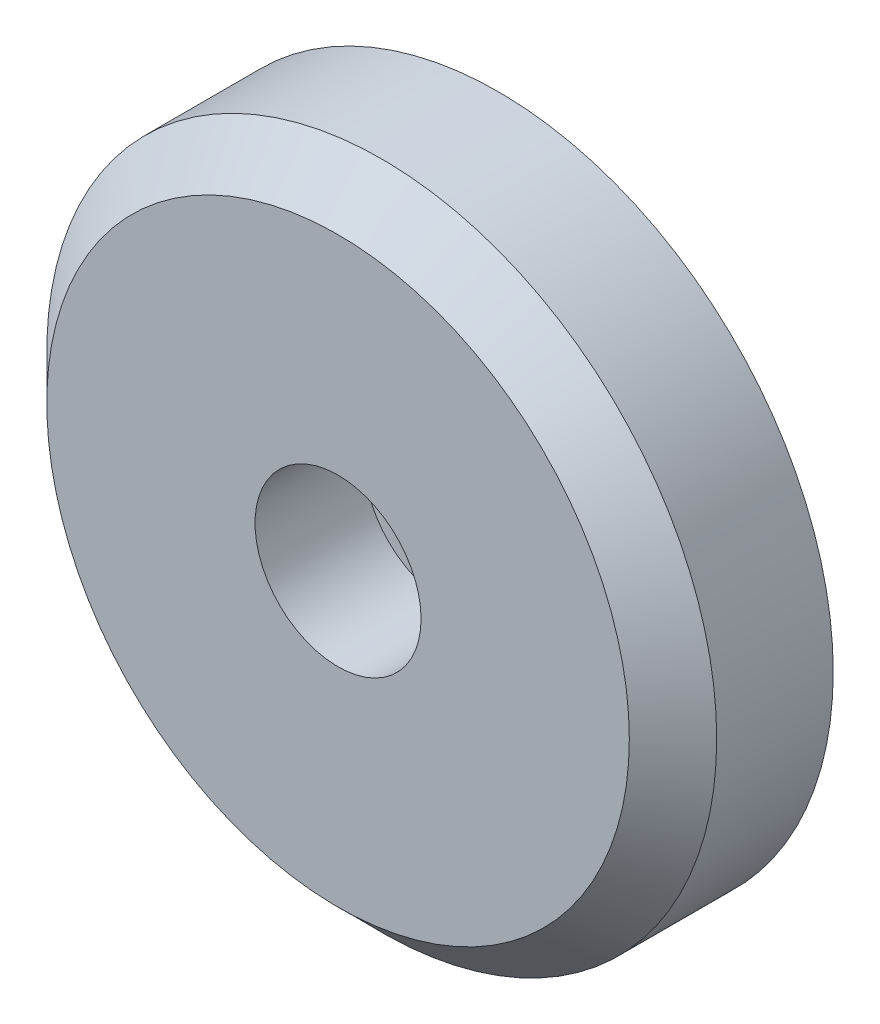
ISO-10303-21;
HEADER;
FILE_DESCRIPTION(('STEP AP214'),'2;1');
FILE_NAME('part.step','',(''),(''),'','','');
FILE_SCHEMA(('AUTOMOTIVE_DESIGN { 1 0 10303 214 1 1 1 1 }'));
ENDSEC;
DATA;
#1=APPLICATION_CONTEXT('core data for automotive mechanical design processes');
#2=APPLICATION_PROTOCOL_DEFINITION('international standard','automotive_design',2000,#1);
#3=PRODUCT_CONTEXT('',#1,'mechanical');
#4=PRODUCT('Part','Part','',(#3));
#5=PRODUCT_RELATED_PRODUCT_CATEGORY('part','',(#4));
#6=PRODUCT_DEFINITION_FORMATION('','',#4);
#7=PRODUCT_DEFINITION_CONTEXT('part definition',#1,'design');
#8=PRODUCT_DEFINITION('design','',#6,#7);
#9=PRODUCT_DEFINITION_SHAPE('','',#8);
#10=(LENGTH_UNIT() NAMED_UNIT(*) SI_UNIT(.MILLI.,.METRE.));
#11=(NAMED_UNIT(*) PLANE_ANGLE_UNIT() SI_UNIT($,.RADIAN.));
#12=(NAMED_UNIT(*) SI_UNIT($,.STERADIAN.) SOLID_ANGLE_UNIT());
#13=UNCERTAINTY_MEASURE_WITH_UNIT(LENGTH_MEASURE(1.E-05),#10,'distance_accuracy_value','');
#14=(GEOMETRIC_REPRESENTATION_CONTEXT(3) GLOBAL_UNCERTAINTY_ASSIGNED_CONTEXT((#13)) GLOBAL_UNIT_ASSIGNED_CONTEXT((#10,
#11,#12)) REPRESENTATION_CONTEXT('',''));
#15=CARTESIAN_POINT('',(0.,0.,0.));
#16=DIRECTION('',(0.,0.,1.));
#17=DIRECTION('',(1.,0.,0.));
#18=AXIS2_PLACEMENT_3D('',#15,#16,#17);
#19=CARTESIAN_POINT('',(23.,23.,0.));
#20=DIRECTION('',(0.,0.,1.));
#21=DIRECTION('',(1.,0.,0.));
#22=AXIS2_PLACEMENT_3D('',#19,#20,#21);
#23=CYLINDRICAL_SURFACE('',#22,3.);
#24=CARTESIAN_POINT('',(23.,23.,3.5));
#25=DIRECTION('',(0.,0.,1.));
#26=DIRECTION('',(1.,0.,0.));
#27=AXIS2_PLACEMENT_3D('',#24,#25,#26);
#28=CIRCLE('',#27,3.);
#29=CARTESIAN_POINT('',(26.,23.,3.5));
#30=VERTEX_POINT('',#29);
#31=EDGE_CURVE('E90',#30,#30,#28,.T.);
#32=ORIENTED_EDGE('',*,*,#31,.T.);
#33=EDGE_LOOP('',(#32));
#34=FACE_BOUND('',#33,.T.);
#35=CARTESIAN_POINT('',(23.,23.,0.));
#36=DIRECTION('',(0.,0.,1.));
#37=DIRECTION('',(1.,0.,0.));
#38=AXIS2_PLACEMENT_3D('',#35,#36,#37);
#39=CIRCLE('',#38,3.);
#40=CARTESIAN_POINT('',(26.,23.,0.));
#41=VERTEX_POINT('',#40);
#42=EDGE_CURVE('E57',#41,#41,#39,.T.);
#43=ORIENTED_EDGE('',*,*,#42,.F.);
#44=EDGE_LOOP('',(#43));
#45=FACE_BOUND('',#44,.T.);
#46=ADVANCED_FACE('F41',(#34,#45),#23,.F.);
#47=CARTESIAN_POINT('',(26.,23.,0.));
#48=DIRECTION('',(0.,0.,-1.));
#49=DIRECTION('',(-1.,0.,0.));
#50=AXIS2_PLACEMENT_3D('',#47,#48,#49);
#51=PLANE('',#50);
#52=ORIENTED_EDGE('',*,*,#42,.T.);
#53=EDGE_LOOP('',(#52));
#54=FACE_BOUND('',#53,.T.);
#55=CARTESIAN_POINT('',(23.,23.,0.));
#56=DIRECTION('',(0.,0.,1.));
#57=DIRECTION('',(1.,0.,0.));
#58=AXIS2_PLACEMENT_3D('',#55,#56,#57);
#59=CIRCLE('',#58,12.2);
#60=CARTESIAN_POINT('',(35.2,23.,0.));
#61=VERTEX_POINT('',#60);
#62=EDGE_CURVE('E62',#61,#61,#59,.T.);
#63=ORIENTED_EDGE('',*,*,#62,.F.);
#64=EDGE_LOOP('',(#63));
#65=FACE_BOUND('',#64,.T.);
#66=ADVANCED_FACE('F111',(#54,#65),#51,.T.);
#67=CARTESIAN_POINT('',(23.,23.,0.));
#68=DIRECTION('',(0.,0.,1.));
#69=DIRECTION('',(1.,0.,0.));
#70=AXIS2_PLACEMENT_3D('',#67,#68,#69);
#71=CYLINDRICAL_SURFACE('',#70,12.2);
#72=ORIENTED_EDGE('',*,*,#62,.T.);
#73=EDGE_LOOP('',(#72));
#74=FACE_BOUND('',#73,.T.);
#75=CARTESIAN_POINT('',(23.,23.,5.8));
#76=DIRECTION('',(0.,0.,1.));
#77=DIRECTION('',(1.,0.,0.));
#78=AXIS2_PLACEMENT_3D('',#75,#76,#77);
#79=CIRCLE('',#78,12.2);
#80=CARTESIAN_POINT('',(35.2,23.,5.8));
#81=VERTEX_POINT('',#80);
#82=EDGE_CURVE('E68',#81,#81,#79,.T.);
#83=ORIENTED_EDGE('',*,*,#82,.F.);
#84=EDGE_LOOP('',(#83));
#85=FACE_BOUND('',#84,.T.);
#86=ADVANCED_FACE('F115',(#74,#85),#71,.T.);
#87=CARTESIAN_POINT('',(35.2,23.,5.8));
#88=DIRECTION('',(0.,0.,-1.));
#89=DIRECTION('',(-1.,0.,0.));
#90=AXIS2_PLACEMENT_3D('',#87,#88,#89);
#91=PLANE('',#90);
#92=ORIENTED_EDGE('',*,*,#82,.T.);
#93=EDGE_LOOP('',(#92));
#94=FACE_BOUND('',#93,.T.);
#95=CARTESIAN_POINT('',(23.,23.,5.8));
#96=DIRECTION('',(0.,0.,1.));
#97=DIRECTION('',(1.,0.,0.));
#98=AXIS2_PLACEMENT_3D('',#95,#96,#97);
#99=CIRCLE('',#98,21.3);
#100=CARTESIAN_POINT('',(44.3,23.,5.8));
#101=VERTEX_POINT('',#100);
#102=EDGE_CURVE('E72',#101,#101,#99,.T.);
#103=ORIENTED_EDGE('',*,*,#102,.F.);
#104=EDGE_LOOP('',(#103));
#105=FACE_BOUND('',#104,.T.);
#106=ADVANCED_FACE('F121',(#94,#105),#91,.T.);
#107=CARTESIAN_POINT('',(23.,23.,0.));
#108=DIRECTION('',(0.,0.,1.));
#109=DIRECTION('',(1.,0.,0.));
#110=AXIS2_PLACEMENT_3D('',#107,#108,#109);
#111=CYLINDRICAL_SURFACE('',#110,21.3);
#112=ORIENTED_EDGE('',*,*,#102,.T.);
#113=EDGE_LOOP('',(#112));
#114=FACE_BOUND('',#113,.T.);
#115=CARTESIAN_POINT('',(23.,23.,0.));
#116=DIRECTION('',(0.,0.,1.));
#117=DIRECTION('',(1.,0.,0.));
#118=AXIS2_PLACEMENT_3D('',#115,#116,#117);
#119=CIRCLE('',#118,21.3);
#120=CARTESIAN_POINT('',(44.3,23.,0.));
#121=VERTEX_POINT('',#120);
#122=EDGE_CURVE('E76',#121,#121,#119,.T.);
#123=ORIENTED_EDGE('',*,*,#122,.F.);
#124=EDGE_LOOP('',(#123));
#125=FACE_BOUND('',#124,.T.);
#126=ADVANCED_FACE('F125',(#114,#125),#111,.F.);
#127=CARTESIAN_POINT('',(44.3,23.,0.));
#128=DIRECTION('',(0.,0.,-1.));
#129=DIRECTION('',(-1.,0.,0.));
#130=AXIS2_PLACEMENT_3D('',#127,#128,#129);
#131=PLANE('',#130);
#132=ORIENTED_EDGE('',*,*,#122,.T.);
#133=EDGE_LOOP('',(#132));
#134=FACE_BOUND('',#133,.T.);
#135=CARTESIAN_POINT('',(23.,23.,0.));
#136=DIRECTION('',(0.,0.,1.));
#137=DIRECTION('',(1.,0.,0.));
#138=AXIS2_PLACEMENT_3D('',#135,#136,#137);
#139=CIRCLE('',#138,23.);
#140=CARTESIAN_POINT('',(46.,23.,0.));
#141=VERTEX_POINT('',#140);
#142=EDGE_CURVE('E79',#141,#141,#139,.T.);
#143=ORIENTED_EDGE('',*,*,#142,.F.);
#144=EDGE_LOOP('',(#143));
#145=FACE_BOUND('',#144,.T.);
#146=ADVANCED_FACE('F129',(#134,#145),#131,.T.);
#147=CARTESIAN_POINT('',(23.,23.,0.));
#148=DIRECTION('',(0.,0.,1.));
#149=DIRECTION('',(1.,0.,0.));
#150=AXIS2_PLACEMENT_3D('',#147,#148,#149);
#151=CYLINDRICAL_SURFACE('',#150,23.);
#152=CARTESIAN_POINT('',(23.,23.,8.));
#153=DIRECTION('',(0.,0.,1.));
#154=DIRECTION('',(1.,0.,0.));
#155=AXIS2_PLACEMENT_3D('',#152,#153,#154);
#156=CIRCLE('',#155,23.);
#157=CARTESIAN_POINT('',(46.,23.,8.));
#158=VERTEX_POINT('',#157);
#159=EDGE_CURVE('E10',#158,#158,#156,.F.);
#160=ORIENTED_EDGE('',*,*,#159,.T.);
#161=EDGE_LOOP('',(#160));
#162=FACE_BOUND('',#161,.T.);
#163=ORIENTED_EDGE('',*,*,#142,.T.);
#164=EDGE_LOOP('',(#163));
#165=FACE_BOUND('',#164,.T.);
#166=ADVANCED_FACE('F133',(#162,#165),#151,.T.);
#167=CARTESIAN_POINT('',(46.,23.,11.));
#168=DIRECTION('',(0.,0.,1.));
#169=DIRECTION('',(1.,0.,0.));
#170=AXIS2_PLACEMENT_3D('',#167,#168,#169);
#171=PLANE('',#170);
#172=CARTESIAN_POINT('',(23.,23.,11.));
#173=DIRECTION('',(0.,0.,1.));
#174=DIRECTION('',(1.,0.,0.));
#175=AXIS2_PLACEMENT_3D('',#172,#173,#174);
#176=CIRCLE('',#175,20.);
#177=CARTESIAN_POINT('',(43.,23.,11.));
#178=VERTEX_POINT('',#177);
#179=EDGE_CURVE('E50',#178,#178,#176,.T.);
#180=ORIENTED_EDGE('',*,*,#179,.T.);
#181=EDGE_LOOP('',(#180));
#182=FACE_BOUND('',#181,.T.);
#183=CARTESIAN_POINT('',(23.,23.,11.));
#184=DIRECTION('',(0.,0.,1.));
#185=DIRECTION('',(1.,0.,0.));
#186=AXIS2_PLACEMENT_3D('',#183,#184,#185);
#187=CIRCLE('',#186,5.7);
#188=CARTESIAN_POINT('',(28.7,23.,11.));
#189=VERTEX_POINT('',#188);
#190=EDGE_CURVE('E83',#189,#189,#187,.T.);
#191=ORIENTED_EDGE('',*,*,#190,.F.);
#192=EDGE_LOOP('',(#191));
#193=FACE_BOUND('',#192,.T.);
#194=ADVANCED_FACE('F107',(#182,#193),#171,.T.);
#195=CARTESIAN_POINT('',(23.,23.,0.));
#196=DIRECTION('',(0.,0.,1.));
#197=DIRECTION('',(1.,0.,0.));
#198=AXIS2_PLACEMENT_3D('',#195,#196,#197);
#199=CYLINDRICAL_SURFACE('',#198,5.7);
#200=ORIENTED_EDGE('',*,*,#190,.T.);
#201=EDGE_LOOP('',(#200));
#202=FACE_BOUND('',#201,.T.);
#203=CARTESIAN_POINT('',(23.,23.,3.5));
#204=DIRECTION('',(0.,0.,1.));
#205=DIRECTION('',(1.,0.,0.));
#206=AXIS2_PLACEMENT_3D('',#203,#204,#205);
#207=CIRCLE('',#206,5.7);
#208=CARTESIAN_POINT('',(28.7,23.,3.5));
#209=VERTEX_POINT('',#208);
#210=EDGE_CURVE('E87',#209,#209,#207,.T.);
#211=ORIENTED_EDGE('',*,*,#210,.F.);
#212=EDGE_LOOP('',(#211));
#213=FACE_BOUND('',#212,.T.);
#214=ADVANCED_FACE('F99',(#202,#213),#199,.F.);
#215=CARTESIAN_POINT('',(28.7,23.,3.5));
#216=DIRECTION('',(0.,0.,1.));
#217=DIRECTION('',(1.,0.,0.));
#218=AXIS2_PLACEMENT_3D('',#215,#216,#217);
#219=PLANE('',#218);
#220=ORIENTED_EDGE('',*,*,#210,.T.);
#221=EDGE_LOOP('',(#220));
#222=FACE_BOUND('',#221,.T.);
#223=ORIENTED_EDGE('',*,*,#31,.F.);
#224=EDGE_LOOP('',(#223));
#225=FACE_BOUND('',#224,.T.);
#226=ADVANCED_FACE('F97',(#222,#225),#219,.T.);
#227=CARTESIAN_POINT('',(23.,23.,11.));
#228=DIRECTION('',(0.,0.,-1.));
#229=DIRECTION('',(-1.,0.,0.));
#230=AXIS2_PLACEMENT_3D('',#227,#228,#229);
#231=CONICAL_SURFACE('',#230,20.,0.785398163397449);
#232=ORIENTED_EDGE('',*,*,#159,.F.);
#233=EDGE_LOOP('',(#232));
#234=FACE_BOUND('',#233,.T.);
#235=ORIENTED_EDGE('',*,*,#179,.F.);
#236=EDGE_LOOP('',(#235));
#237=FACE_BOUND('',#236,.T.);
#238=ADVANCED_FACE('F44',(#234,#237),#231,.T.);
#239=CLOSED_SHELL('',(#46,#66,#86,#106,#126,#146,#166,#194,#214,#226,#238));
#240=MANIFOLD_SOLID_BREP('B2',#239);
#241=ADVANCED_BREP_SHAPE_REPRESENTATION('',(#18,#240),#14);
#242=SHAPE_DEFINITION_REPRESENTATION(#9,#241);
ENDSEC;
END-ISO-10303-21;
